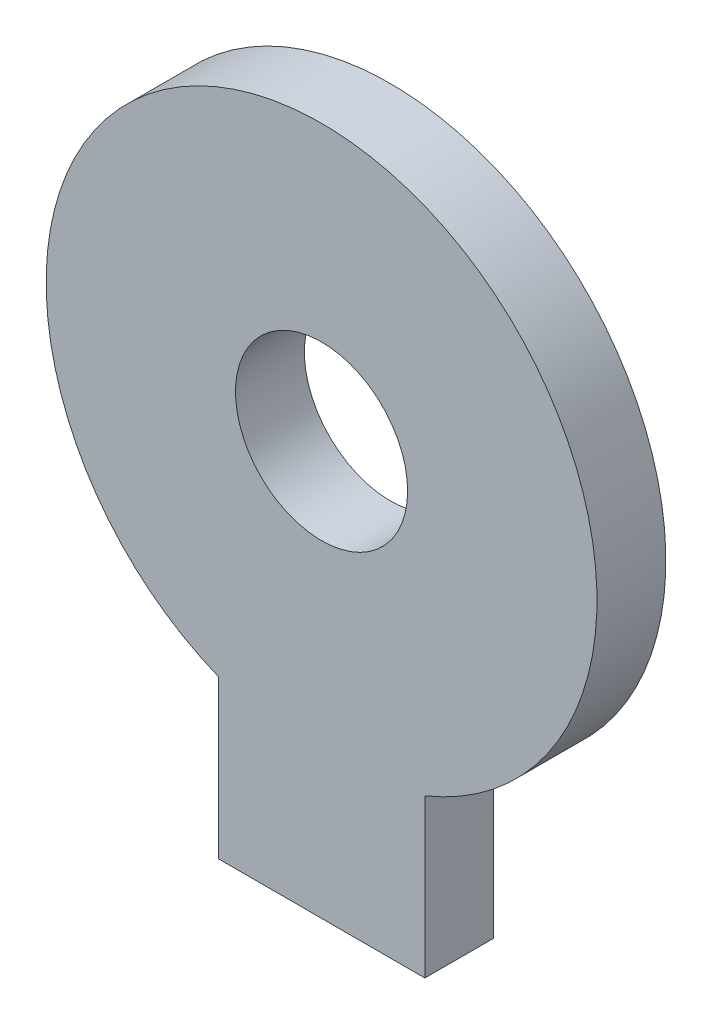
ISO-10303-21;
HEADER;
FILE_DESCRIPTION(('STEP AP214'),'2;1');
FILE_NAME('part.step','',(''),(''),'','','');
FILE_SCHEMA(('AUTOMOTIVE_DESIGN { 1 0 10303 214 1 1 1 1 }'));
ENDSEC;
DATA;
#1=APPLICATION_CONTEXT('core data for automotive mechanical design processes');
#2=APPLICATION_PROTOCOL_DEFINITION('international standard','automotive_design',2000,#1);
#3=PRODUCT_CONTEXT('',#1,'mechanical');
#4=PRODUCT('Part','Part','',(#3));
#5=PRODUCT_RELATED_PRODUCT_CATEGORY('part','',(#4));
#6=PRODUCT_DEFINITION_FORMATION('','',#4);
#7=PRODUCT_DEFINITION_CONTEXT('part definition',#1,'design');
#8=PRODUCT_DEFINITION('design','',#6,#7);
#9=PRODUCT_DEFINITION_SHAPE('','',#8);
#10=(LENGTH_UNIT() NAMED_UNIT(*) SI_UNIT(.MILLI.,.METRE.));
#11=(NAMED_UNIT(*) PLANE_ANGLE_UNIT() SI_UNIT($,.RADIAN.));
#12=(NAMED_UNIT(*) SI_UNIT($,.STERADIAN.) SOLID_ANGLE_UNIT());
#13=UNCERTAINTY_MEASURE_WITH_UNIT(LENGTH_MEASURE(1.E-05),#10,'distance_accuracy_value','');
#14=(GEOMETRIC_REPRESENTATION_CONTEXT(3) GLOBAL_UNCERTAINTY_ASSIGNED_CONTEXT((#13)) GLOBAL_UNIT_ASSIGNED_CONTEXT((#10,
#11,#12)) REPRESENTATION_CONTEXT('',''));
#15=CARTESIAN_POINT('',(0.,0.,0.));
#16=DIRECTION('',(0.,0.,1.));
#17=DIRECTION('',(1.,0.,0.));
#18=AXIS2_PLACEMENT_3D('',#15,#16,#17);
#19=CARTESIAN_POINT('',(0.,0.,-2.));
#20=DIRECTION('',(-1.,0.,0.));
#21=DIRECTION('',(0.,0.,1.));
#22=AXIS2_PLACEMENT_3D('',#19,#20,#21);
#23=PLANE('',#22);
#24=DIRECTION('',(0.,-1.,0.));
#25=VECTOR('',#24,1.);
#26=CARTESIAN_POINT('',(0.,0.,0.));
#27=LINE('',#26,#25);
#28=CARTESIAN_POINT('',(0.,4.58380151290433,0.));
#29=VERTEX_POINT('',#28);
#30=CARTESIAN_POINT('',(0.,0.,0.));
#31=VERTEX_POINT('',#30);
#32=EDGE_CURVE('E73',#29,#31,#27,.T.);
#33=ORIENTED_EDGE('',*,*,#32,.F.);
#34=DIRECTION('',(0.,0.,1.));
#35=VECTOR('',#34,1.);
#36=CARTESIAN_POINT('',(0.,4.58380151290433,-2.));
#37=LINE('',#36,#35);
#38=CARTESIAN_POINT('',(0.,4.58380151290433,-2.));
#39=VERTEX_POINT('',#38);
#40=EDGE_CURVE('E11',#39,#29,#37,.T.);
#41=ORIENTED_EDGE('',*,*,#40,.F.);
#42=DIRECTION('',(0.,-1.,0.));
#43=VECTOR('',#42,1.);
#44=CARTESIAN_POINT('',(0.,0.,-2.));
#45=LINE('',#44,#43);
#46=CARTESIAN_POINT('',(0.,0.,-2.));
#47=VERTEX_POINT('',#46);
#48=EDGE_CURVE('E75',#39,#47,#45,.T.);
#49=ORIENTED_EDGE('',*,*,#48,.T.);
#50=DIRECTION('',(0.,0.,1.));
#51=VECTOR('',#50,1.);
#52=CARTESIAN_POINT('',(0.,0.,-2.));
#53=LINE('',#52,#51);
#54=EDGE_CURVE('E36',#47,#31,#53,.T.);
#55=ORIENTED_EDGE('',*,*,#54,.T.);
#56=EDGE_LOOP('',(#33,#41,#49,#55));
#57=FACE_BOUND('',#56,.T.);
#58=ADVANCED_FACE('F33',(#57),#23,.T.);
#59=CARTESIAN_POINT('',(3.,12.,-2.));
#60=DIRECTION('',(0.,0.,1.));
#61=DIRECTION('',(1.,0.,0.));
#62=AXIS2_PLACEMENT_3D('',#59,#60,#61);
#63=CYLINDRICAL_SURFACE('',#62,8.);
#64=CARTESIAN_POINT('',(3.,12.,0.));
#65=DIRECTION('',(0.,0.,1.));
#66=DIRECTION('',(1.,0.,0.));
#67=AXIS2_PLACEMENT_3D('',#64,#65,#66);
#68=CIRCLE('',#67,8.);
#69=CARTESIAN_POINT('',(6.,4.58380151290433,0.));
#70=VERTEX_POINT('',#69);
#71=EDGE_CURVE('E90',#70,#29,#68,.T.);
#72=ORIENTED_EDGE('',*,*,#71,.F.);
#73=DIRECTION('',(0.,0.,1.));
#74=VECTOR('',#73,1.);
#75=CARTESIAN_POINT('',(6.,4.58380151290433,-2.));
#76=LINE('',#75,#74);
#77=CARTESIAN_POINT('',(6.,4.58380151290433,-2.));
#78=VERTEX_POINT('',#77);
#79=EDGE_CURVE('E41',#78,#70,#76,.T.);
#80=ORIENTED_EDGE('',*,*,#79,.F.);
#81=CARTESIAN_POINT('',(3.,12.,-2.));
#82=DIRECTION('',(0.,0.,1.));
#83=DIRECTION('',(1.,0.,0.));
#84=AXIS2_PLACEMENT_3D('',#81,#82,#83);
#85=CIRCLE('',#84,8.);
#86=EDGE_CURVE('E80',#78,#39,#85,.T.);
#87=ORIENTED_EDGE('',*,*,#86,.T.);
#88=ORIENTED_EDGE('',*,*,#40,.T.);
#89=EDGE_LOOP('',(#72,#80,#87,#88));
#90=FACE_BOUND('',#89,.T.);
#91=ADVANCED_FACE('F110',(#90),#63,.T.);
#92=CARTESIAN_POINT('',(6.,0.,-2.));
#93=DIRECTION('',(1.,0.,0.));
#94=DIRECTION('',(0.,0.,-1.));
#95=AXIS2_PLACEMENT_3D('',#92,#93,#94);
#96=PLANE('',#95);
#97=DIRECTION('',(0.,1.,0.));
#98=VECTOR('',#97,1.);
#99=CARTESIAN_POINT('',(6.,0.,0.));
#100=LINE('',#99,#98);
#101=CARTESIAN_POINT('',(6.,0.,0.));
#102=VERTEX_POINT('',#101);
#103=EDGE_CURVE('E87',#102,#70,#100,.T.);
#104=ORIENTED_EDGE('',*,*,#103,.F.);
#105=DIRECTION('',(0.,0.,1.));
#106=VECTOR('',#105,1.);
#107=CARTESIAN_POINT('',(6.,0.,-2.));
#108=LINE('',#107,#106);
#109=CARTESIAN_POINT('',(6.,0.,-2.));
#110=VERTEX_POINT('',#109);
#111=EDGE_CURVE('E79',#110,#102,#108,.T.);
#112=ORIENTED_EDGE('',*,*,#111,.F.);
#113=DIRECTION('',(0.,1.,0.));
#114=VECTOR('',#113,1.);
#115=CARTESIAN_POINT('',(6.,0.,-2.));
#116=LINE('',#115,#114);
#117=EDGE_CURVE('E103',#110,#78,#116,.T.);
#118=ORIENTED_EDGE('',*,*,#117,.T.);
#119=ORIENTED_EDGE('',*,*,#79,.T.);
#120=EDGE_LOOP('',(#104,#112,#118,#119));
#121=FACE_BOUND('',#120,.T.);
#122=ADVANCED_FACE('F107',(#121),#96,.T.);
#123=CARTESIAN_POINT('',(0.,0.,-2.));
#124=DIRECTION('',(0.,-1.,0.));
#125=DIRECTION('',(0.,0.,-1.));
#126=AXIS2_PLACEMENT_3D('',#123,#124,#125);
#127=PLANE('',#126);
#128=DIRECTION('',(1.,0.,0.));
#129=VECTOR('',#128,1.);
#130=CARTESIAN_POINT('',(0.,0.,0.));
#131=LINE('',#130,#129);
#132=EDGE_CURVE('E82',#31,#102,#131,.T.);
#133=ORIENTED_EDGE('',*,*,#132,.F.);
#134=ORIENTED_EDGE('',*,*,#54,.F.);
#135=DIRECTION('',(1.,0.,0.));
#136=VECTOR('',#135,1.);
#137=CARTESIAN_POINT('',(0.,0.,-2.));
#138=LINE('',#137,#136);
#139=EDGE_CURVE('E101',#47,#110,#138,.T.);
#140=ORIENTED_EDGE('',*,*,#139,.T.);
#141=ORIENTED_EDGE('',*,*,#111,.T.);
#142=EDGE_LOOP('',(#133,#134,#140,#141));
#143=FACE_BOUND('',#142,.T.);
#144=ADVANCED_FACE('F83',(#143),#127,.T.);
#145=CARTESIAN_POINT('',(3.,12.,-2.));
#146=DIRECTION('',(0.,0.,1.));
#147=DIRECTION('',(1.,0.,0.));
#148=AXIS2_PLACEMENT_3D('',#145,#146,#147);
#149=PLANE('',#148);
#150=CARTESIAN_POINT('',(3.,12.,-2.));
#151=DIRECTION('',(0.,0.,1.));
#152=DIRECTION('',(1.,0.,0.));
#153=AXIS2_PLACEMENT_3D('',#150,#151,#152);
#154=CIRCLE('',#153,2.5);
#155=CARTESIAN_POINT('',(5.5,12.,-2.));
#156=VERTEX_POINT('',#155);
#157=EDGE_CURVE('E91',#156,#156,#154,.T.);
#158=ORIENTED_EDGE('',*,*,#157,.T.);
#159=EDGE_LOOP('',(#158));
#160=FACE_BOUND('',#159,.T.);
#161=ORIENTED_EDGE('',*,*,#48,.F.);
#162=ORIENTED_EDGE('',*,*,#86,.F.);
#163=ORIENTED_EDGE('',*,*,#117,.F.);
#164=ORIENTED_EDGE('',*,*,#139,.F.);
#165=EDGE_LOOP('',(#161,#162,#163,#164));
#166=FACE_BOUND('',#165,.T.);
#167=ADVANCED_FACE('F112',(#160,#166),#149,.F.);
#168=CARTESIAN_POINT('',(3.,12.,0.));
#169=DIRECTION('',(0.,0.,1.));
#170=DIRECTION('',(1.,0.,0.));
#171=AXIS2_PLACEMENT_3D('',#168,#169,#170);
#172=PLANE('',#171);
#173=CARTESIAN_POINT('',(3.,12.,0.));
#174=DIRECTION('',(0.,0.,1.));
#175=DIRECTION('',(1.,0.,0.));
#176=AXIS2_PLACEMENT_3D('',#173,#174,#175);
#177=CIRCLE('',#176,2.5);
#178=CARTESIAN_POINT('',(5.5,12.,0.));
#179=VERTEX_POINT('',#178);
#180=EDGE_CURVE('E94',#179,#179,#177,.T.);
#181=ORIENTED_EDGE('',*,*,#180,.F.);
#182=EDGE_LOOP('',(#181));
#183=FACE_BOUND('',#182,.T.);
#184=ORIENTED_EDGE('',*,*,#32,.T.);
#185=ORIENTED_EDGE('',*,*,#132,.T.);
#186=ORIENTED_EDGE('',*,*,#103,.T.);
#187=ORIENTED_EDGE('',*,*,#71,.T.);
#188=EDGE_LOOP('',(#184,#185,#186,#187));
#189=FACE_BOUND('',#188,.T.);
#190=ADVANCED_FACE('F89',(#183,#189),#172,.T.);
#191=CARTESIAN_POINT('',(3.,12.,-2.));
#192=DIRECTION('',(0.,0.,1.));
#193=DIRECTION('',(1.,0.,0.));
#194=AXIS2_PLACEMENT_3D('',#191,#192,#193);
#195=CYLINDRICAL_SURFACE('',#194,2.5);
#196=ORIENTED_EDGE('',*,*,#157,.F.);
#197=EDGE_LOOP('',(#196));
#198=FACE_BOUND('',#197,.T.);
#199=ORIENTED_EDGE('',*,*,#180,.T.);
#200=EDGE_LOOP('',(#199));
#201=FACE_BOUND('',#200,.T.);
#202=ADVANCED_FACE('F120',(#198,#201),#195,.F.);
#203=CLOSED_SHELL('',(#58,#91,#122,#144,#167,#190,#202));
#204=MANIFOLD_SOLID_BREP('B2',#203);
#205=ADVANCED_BREP_SHAPE_REPRESENTATION('',(#18,#204),#14);
#206=SHAPE_DEFINITION_REPRESENTATION(#9,#205);
ENDSEC;
END-ISO-10303-21;
